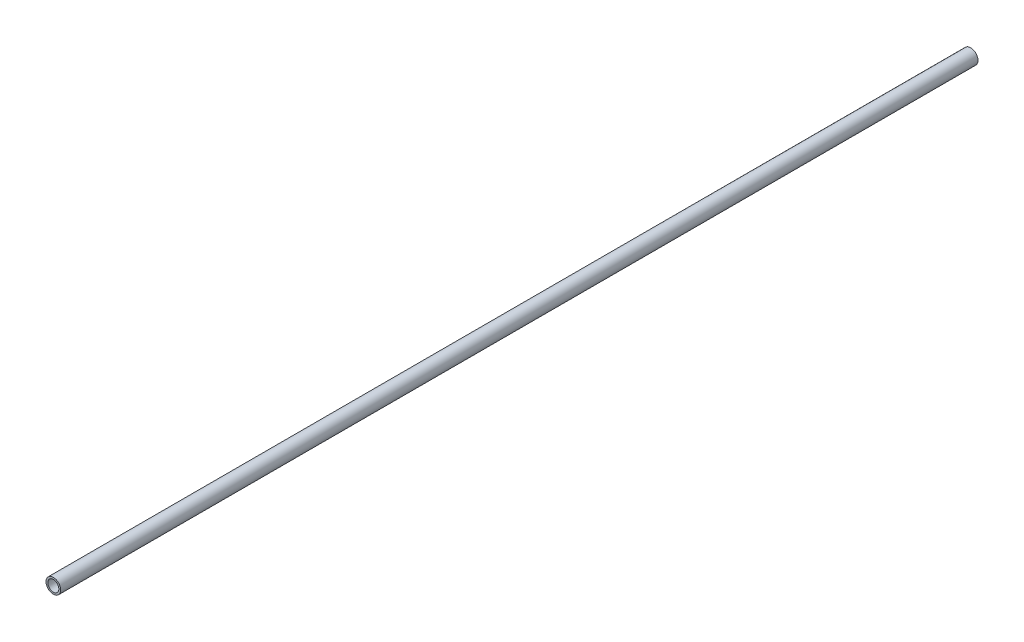
ISO-10303-21;
HEADER;
FILE_DESCRIPTION(('STEP AP214'),'2;1');
FILE_NAME('part.step','',(''),(''),'','','');
FILE_SCHEMA(('AUTOMOTIVE_DESIGN { 1 0 10303 214 1 1 1 1 }'));
ENDSEC;
DATA;
#1=APPLICATION_CONTEXT('core data for automotive mechanical design processes');
#2=APPLICATION_PROTOCOL_DEFINITION('international standard','automotive_design',2000,#1);
#3=PRODUCT_CONTEXT('',#1,'mechanical');
#4=PRODUCT('Part','Part','',(#3));
#5=PRODUCT_RELATED_PRODUCT_CATEGORY('part','',(#4));
#6=PRODUCT_DEFINITION_FORMATION('','',#4);
#7=PRODUCT_DEFINITION_CONTEXT('part definition',#1,'design');
#8=PRODUCT_DEFINITION('design','',#6,#7);
#9=PRODUCT_DEFINITION_SHAPE('','',#8);
#10=(LENGTH_UNIT() NAMED_UNIT(*) SI_UNIT(.MILLI.,.METRE.));
#11=(NAMED_UNIT(*) PLANE_ANGLE_UNIT() SI_UNIT($,.RADIAN.));
#12=(NAMED_UNIT(*) SI_UNIT($,.STERADIAN.) SOLID_ANGLE_UNIT());
#13=UNCERTAINTY_MEASURE_WITH_UNIT(LENGTH_MEASURE(1.E-05),#10,'distance_accuracy_value','');
#14=(GEOMETRIC_REPRESENTATION_CONTEXT(3) GLOBAL_UNCERTAINTY_ASSIGNED_CONTEXT((#13)) GLOBAL_UNIT_ASSIGNED_CONTEXT((#10,
#11,#12)) REPRESENTATION_CONTEXT('',''));
#15=CARTESIAN_POINT('',(0.,0.,0.));
#16=DIRECTION('',(0.,0.,1.));
#17=DIRECTION('',(1.,0.,0.));
#18=AXIS2_PLACEMENT_3D('',#15,#16,#17);
#19=CARTESIAN_POINT('',(0.,0.,500.));
#20=DIRECTION('',(0.,0.,-1.));
#21=DIRECTION('',(-1.,0.,0.));
#22=AXIS2_PLACEMENT_3D('',#19,#20,#21);
#23=CYLINDRICAL_SURFACE('',#22,4.);
#24=CARTESIAN_POINT('',(0.,0.,500.));
#25=DIRECTION('',(0.,0.,1.));
#26=DIRECTION('',(1.,0.,0.));
#27=AXIS2_PLACEMENT_3D('',#24,#25,#26);
#28=CIRCLE('',#27,4.);
#29=CARTESIAN_POINT('',(4.,0.,500.));
#30=VERTEX_POINT('',#29);
#31=EDGE_CURVE('E10',#30,#30,#28,.T.);
#32=ORIENTED_EDGE('',*,*,#31,.F.);
#33=EDGE_LOOP('',(#32));
#34=FACE_BOUND('',#33,.T.);
#35=CARTESIAN_POINT('',(0.,0.,0.));
#36=DIRECTION('',(0.,0.,1.));
#37=DIRECTION('',(1.,0.,0.));
#38=AXIS2_PLACEMENT_3D('',#35,#36,#37);
#39=CIRCLE('',#38,4.);
#40=CARTESIAN_POINT('',(4.,0.,0.));
#41=VERTEX_POINT('',#40);
#42=EDGE_CURVE('E46',#41,#41,#39,.T.);
#43=ORIENTED_EDGE('',*,*,#42,.T.);
#44=EDGE_LOOP('',(#43));
#45=FACE_BOUND('',#44,.T.);
#46=ADVANCED_FACE('F43',(#34,#45),#23,.T.);
#47=CARTESIAN_POINT('',(0.,0.,500.));
#48=DIRECTION('',(0.,0.,1.));
#49=DIRECTION('',(1.,0.,0.));
#50=AXIS2_PLACEMENT_3D('',#47,#48,#49);
#51=PLANE('',#50);
#52=CARTESIAN_POINT('',(0.,0.,500.));
#53=DIRECTION('',(0.,0.,1.));
#54=DIRECTION('',(1.,0.,0.));
#55=AXIS2_PLACEMENT_3D('',#52,#53,#54);
#56=CIRCLE('',#55,3.);
#57=CARTESIAN_POINT('',(3.,0.,500.));
#58=VERTEX_POINT('',#57);
#59=EDGE_CURVE('E57',#58,#58,#56,.T.);
#60=ORIENTED_EDGE('',*,*,#59,.F.);
#61=EDGE_LOOP('',(#60));
#62=FACE_BOUND('',#61,.T.);
#63=ORIENTED_EDGE('',*,*,#31,.T.);
#64=EDGE_LOOP('',(#63));
#65=FACE_BOUND('',#64,.T.);
#66=ADVANCED_FACE('F74',(#62,#65),#51,.T.);
#67=CARTESIAN_POINT('',(0.,0.,0.));
#68=DIRECTION('',(0.,0.,1.));
#69=DIRECTION('',(1.,0.,0.));
#70=AXIS2_PLACEMENT_3D('',#67,#68,#69);
#71=PLANE('',#70);
#72=CARTESIAN_POINT('',(0.,0.,0.));
#73=DIRECTION('',(0.,0.,1.));
#74=DIRECTION('',(1.,0.,0.));
#75=AXIS2_PLACEMENT_3D('',#72,#73,#74);
#76=CIRCLE('',#75,3.);
#77=CARTESIAN_POINT('',(3.,0.,0.));
#78=VERTEX_POINT('',#77);
#79=EDGE_CURVE('E55',#78,#78,#76,.T.);
#80=ORIENTED_EDGE('',*,*,#79,.T.);
#81=EDGE_LOOP('',(#80));
#82=FACE_BOUND('',#81,.T.);
#83=ORIENTED_EDGE('',*,*,#42,.F.);
#84=EDGE_LOOP('',(#83));
#85=FACE_BOUND('',#84,.T.);
#86=ADVANCED_FACE('F65',(#82,#85),#71,.F.);
#87=CARTESIAN_POINT('',(0.,0.,0.));
#88=DIRECTION('',(0.,0.,1.));
#89=DIRECTION('',(1.,0.,0.));
#90=AXIS2_PLACEMENT_3D('',#87,#88,#89);
#91=CYLINDRICAL_SURFACE('',#90,3.);
#92=ORIENTED_EDGE('',*,*,#79,.F.);
#93=EDGE_LOOP('',(#92));
#94=FACE_BOUND('',#93,.T.);
#95=ORIENTED_EDGE('',*,*,#59,.T.);
#96=EDGE_LOOP('',(#95));
#97=FACE_BOUND('',#96,.T.);
#98=ADVANCED_FACE('F68',(#94,#97),#91,.F.);
#99=CLOSED_SHELL('',(#46,#66,#86,#98));
#100=MANIFOLD_SOLID_BREP('B2',#99);
#101=ADVANCED_BREP_SHAPE_REPRESENTATION('',(#18,#100),#14);
#102=SHAPE_DEFINITION_REPRESENTATION(#9,#101);
ENDSEC;
END-ISO-10303-21;
